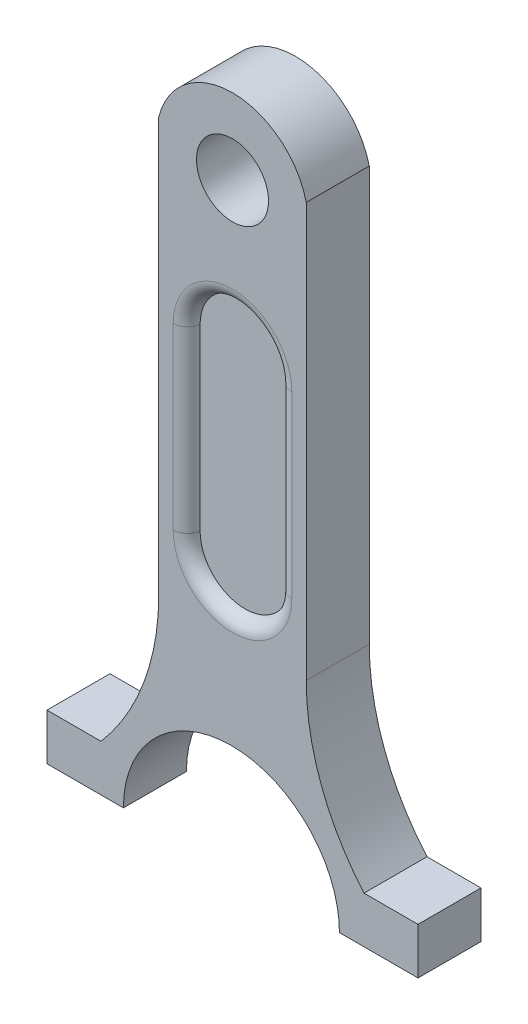
ISO-10303-21;
HEADER;
FILE_DESCRIPTION(('STEP AP214'),'2;1');
FILE_NAME('part.step','',(''),(''),'','','');
FILE_SCHEMA(('AUTOMOTIVE_DESIGN { 1 0 10303 214 1 1 1 1 }'));
ENDSEC;
DATA;
#1=APPLICATION_CONTEXT('core data for automotive mechanical design processes');
#2=APPLICATION_PROTOCOL_DEFINITION('international standard','automotive_design',2000,#1);
#3=PRODUCT_CONTEXT('',#1,'mechanical');
#4=PRODUCT('Part','Part','',(#3));
#5=PRODUCT_RELATED_PRODUCT_CATEGORY('part','',(#4));
#6=PRODUCT_DEFINITION_FORMATION('','',#4);
#7=PRODUCT_DEFINITION_CONTEXT('part definition',#1,'design');
#8=PRODUCT_DEFINITION('design','',#6,#7);
#9=PRODUCT_DEFINITION_SHAPE('','',#8);
#10=(LENGTH_UNIT() NAMED_UNIT(*) SI_UNIT(.MILLI.,.METRE.));
#11=(NAMED_UNIT(*) PLANE_ANGLE_UNIT() SI_UNIT($,.RADIAN.));
#12=(NAMED_UNIT(*) SI_UNIT($,.STERADIAN.) SOLID_ANGLE_UNIT());
#13=UNCERTAINTY_MEASURE_WITH_UNIT(LENGTH_MEASURE(1.E-05),#10,'distance_accuracy_value','');
#14=(GEOMETRIC_REPRESENTATION_CONTEXT(3) GLOBAL_UNCERTAINTY_ASSIGNED_CONTEXT((#13)) GLOBAL_UNIT_ASSIGNED_CONTEXT((#10,
#11,#12)) REPRESENTATION_CONTEXT('',''));
#15=CARTESIAN_POINT('',(0.,0.,0.));
#16=DIRECTION('',(0.,0.,1.));
#17=DIRECTION('',(1.,0.,0.));
#18=AXIS2_PLACEMENT_3D('',#15,#16,#17);
#19=CARTESIAN_POINT('',(0.,-10.7029486859636,8.89));
#20=DIRECTION('',(0.,0.,-1.));
#21=DIRECTION('',(-1.,0.,0.));
#22=AXIS2_PLACEMENT_3D('',#19,#20,#21);
#23=PLANE('',#22);
#24=DIRECTION('',(0.,-1.,0.));
#25=VECTOR('',#24,1.);
#26=CARTESIAN_POINT('',(-8.36606249903122,-10.7029486859636,8.89));
#27=LINE('',#26,#25);
#28=CARTESIAN_POINT('',(-8.36606249903122,-57.618798646351,8.89));
#29=VERTEX_POINT('',#28);
#30=CARTESIAN_POINT('',(-8.36606249903122,-32.3670987255763,8.89));
#31=VERTEX_POINT('',#30);
#32=EDGE_CURVE('E57',#29,#31,#27,.F.);
#33=ORIENTED_EDGE('',*,*,#32,.T.);
#34=CARTESIAN_POINT('',(0.,-32.3670987255763,8.89));
#35=DIRECTION('',(0.,0.,-1.));
#36=DIRECTION('',(-1.,0.,0.));
#37=AXIS2_PLACEMENT_3D('',#34,#35,#36);
#38=CIRCLE('',#37,8.36606249903122);
#39=CARTESIAN_POINT('',(8.36606249903122,-32.3670987255763,8.89));
#40=VERTEX_POINT('',#39);
#41=EDGE_CURVE('E11',#31,#40,#38,.T.);
#42=ORIENTED_EDGE('',*,*,#41,.T.);
#43=DIRECTION('',(0.,-1.,0.));
#44=VECTOR('',#43,1.);
#45=CARTESIAN_POINT('',(8.36606249903122,-10.7029486859636,8.89));
#46=LINE('',#45,#44);
#47=CARTESIAN_POINT('',(8.36606249903122,-57.618798646351,8.89));
#48=VERTEX_POINT('',#47);
#49=EDGE_CURVE('E377',#40,#48,#46,.T.);
#50=ORIENTED_EDGE('',*,*,#49,.T.);
#51=CARTESIAN_POINT('',(0.,-57.618798646351,8.89));
#52=DIRECTION('',(0.,0.,-1.));
#53=DIRECTION('',(-1.,0.,0.));
#54=AXIS2_PLACEMENT_3D('',#51,#52,#53);
#55=CIRCLE('',#54,8.36606249903122);
#56=EDGE_CURVE('E68',#48,#29,#55,.T.);
#57=ORIENTED_EDGE('',*,*,#56,.T.);
#58=EDGE_LOOP('',(#33,#42,#50,#57));
#59=FACE_BOUND('',#58,.T.);
#60=CARTESIAN_POINT('',(0.,-10.7029486859636,8.89));
#61=DIRECTION('',(0.,0.,1.));
#62=DIRECTION('',(1.,0.,0.));
#63=AXIS2_PLACEMENT_3D('',#60,#61,#62);
#64=CIRCLE('',#63,5.08);
#65=CARTESIAN_POINT('',(5.08,-10.7029486859636,8.89));
#66=VERTEX_POINT('',#65);
#67=EDGE_CURVE('E298',#66,#66,#64,.T.);
#68=ORIENTED_EDGE('',*,*,#67,.F.);
#69=EDGE_LOOP('',(#68));
#70=FACE_BOUND('',#69,.T.);
#71=DIRECTION('',(1.,0.,0.));
#72=VECTOR('',#71,1.);
#73=CARTESIAN_POINT('',(-18.55576843554,-95.0893652240123,8.89));
#74=LINE('',#73,#72);
#75=CARTESIAN_POINT('',(-26.17576843554,-95.0893652240123,8.89));
#76=VERTEX_POINT('',#75);
#77=CARTESIAN_POINT('',(-15.3923214707652,-95.0893652240123,8.89));
#78=VERTEX_POINT('',#77);
#79=EDGE_CURVE('E196',#76,#78,#74,.T.);
#80=ORIENTED_EDGE('',*,*,#79,.T.);
#81=CARTESIAN_POINT('',(-0.152321470765215,-95.0893652240123,8.89));
#82=DIRECTION('',(0.,0.,1.));
#83=DIRECTION('',(-1.,0.,0.));
#84=AXIS2_PLACEMENT_3D('',#81,#82,#83);
#85=CIRCLE('',#84,15.24);
#86=CARTESIAN_POINT('',(15.0876785292348,-95.0893652240123,8.89));
#87=VERTEX_POINT('',#86);
#88=EDGE_CURVE('E192',#87,#78,#85,.T.);
#89=ORIENTED_EDGE('',*,*,#88,.F.);
#90=CARTESIAN_POINT('',(26.17576843554,-95.0893652240123,8.89));
#91=VERTEX_POINT('',#90);
#92=EDGE_CURVE('E186',#87,#91,#74,.T.);
#93=ORIENTED_EDGE('',*,*,#92,.T.);
#94=DIRECTION('',(0.,-1.,0.));
#95=VECTOR('',#94,1.);
#96=CARTESIAN_POINT('',(26.17576843554,-88.529258158498,8.89));
#97=LINE('',#96,#95);
#98=CARTESIAN_POINT('',(26.17576843554,-88.529258158498,8.89));
#99=VERTEX_POINT('',#98);
#100=EDGE_CURVE('E191',#99,#91,#97,.T.);
#101=ORIENTED_EDGE('',*,*,#100,.F.);
#102=DIRECTION('',(-1.,0.,0.));
#103=VECTOR('',#102,1.);
#104=CARTESIAN_POINT('',(26.17576843554,-88.529258158498,8.89));
#105=LINE('',#104,#103);
#106=CARTESIAN_POINT('',(18.55576843554,-88.529258158498,8.89));
#107=VERTEX_POINT('',#106);
#108=EDGE_CURVE('E228',#99,#107,#105,.T.);
#109=ORIENTED_EDGE('',*,*,#108,.T.);
#110=CARTESIAN_POINT('',(43.9268272509493,-66.6225886735967,8.89));
#111=DIRECTION('',(0.,0.,-1.));
#112=DIRECTION('',(1.,0.,0.));
#113=AXIS2_PLACEMENT_3D('',#110,#111,#112);
#114=CIRCLE('',#113,33.5200357000953);
#115=CARTESIAN_POINT('',(10.406791550854,-66.6225886735967,8.89));
#116=VERTEX_POINT('',#115);
#117=EDGE_CURVE('E317',#107,#116,#114,.T.);
#118=ORIENTED_EDGE('',*,*,#117,.T.);
#119=DIRECTION('',(0.,1.,0.));
#120=VECTOR('',#119,1.);
#121=CARTESIAN_POINT('',(10.406791550854,-8.20258867359673,8.89));
#122=LINE('',#121,#120);
#123=CARTESIAN_POINT('',(10.406791550854,-8.20258867359673,8.89));
#124=VERTEX_POINT('',#123);
#125=EDGE_CURVE('E320',#116,#124,#122,.T.);
#126=ORIENTED_EDGE('',*,*,#125,.T.);
#127=CARTESIAN_POINT('',(0.,-10.7029486859636,8.89));
#128=DIRECTION('',(0.,0.,1.));
#129=DIRECTION('',(-1.,0.,0.));
#130=AXIS2_PLACEMENT_3D('',#127,#128,#129);
#131=CIRCLE('',#130,10.7029486859636);
#132=CARTESIAN_POINT('',(-10.406791550854,-8.20258867359673,8.89));
#133=VERTEX_POINT('',#132);
#134=EDGE_CURVE('E306',#124,#133,#131,.T.);
#135=ORIENTED_EDGE('',*,*,#134,.T.);
#136=DIRECTION('',(0.,-1.,0.));
#137=VECTOR('',#136,1.);
#138=CARTESIAN_POINT('',(-10.406791550854,-8.20258867359673,8.89));
#139=LINE('',#138,#137);
#140=CARTESIAN_POINT('',(-10.406791550854,-66.6225886735967,8.89));
#141=VERTEX_POINT('',#140);
#142=EDGE_CURVE('E310',#133,#141,#139,.T.);
#143=ORIENTED_EDGE('',*,*,#142,.T.);
#144=CARTESIAN_POINT('',(-43.9268272509493,-66.6225886735967,8.89));
#145=DIRECTION('',(0.,0.,-1.));
#146=DIRECTION('',(-1.,0.,0.));
#147=AXIS2_PLACEMENT_3D('',#144,#145,#146);
#148=CIRCLE('',#147,33.5200357000953);
#149=CARTESIAN_POINT('',(-18.55576843554,-88.529258158498,8.89));
#150=VERTEX_POINT('',#149);
#151=EDGE_CURVE('E197',#141,#150,#148,.T.);
#152=ORIENTED_EDGE('',*,*,#151,.T.);
#153=DIRECTION('',(1.,0.,0.));
#154=VECTOR('',#153,1.);
#155=CARTESIAN_POINT('',(-26.17576843554,-88.529258158498,8.89));
#156=LINE('',#155,#154);
#157=CARTESIAN_POINT('',(-26.17576843554,-88.529258158498,8.89));
#158=VERTEX_POINT('',#157);
#159=EDGE_CURVE('E253',#158,#150,#156,.T.);
#160=ORIENTED_EDGE('',*,*,#159,.F.);
#161=DIRECTION('',(0.,1.,0.));
#162=VECTOR('',#161,1.);
#163=CARTESIAN_POINT('',(-26.17576843554,-88.529258158498,8.89));
#164=LINE('',#163,#162);
#165=EDGE_CURVE('E243',#76,#158,#164,.T.);
#166=ORIENTED_EDGE('',*,*,#165,.F.);
#167=EDGE_LOOP('',(#80,#89,#93,#101,#109,#118,#126,#135,#143,#152,#160,#166));
#168=FACE_BOUND('',#167,.T.);
#169=ADVANCED_FACE('F47',(#59,#70,#168),#23,.F.);
#170=CARTESIAN_POINT('',(-18.55576843554,-95.0893652240123,8.89));
#171=DIRECTION('',(0.,1.,0.));
#172=DIRECTION('',(0.,0.,1.));
#173=AXIS2_PLACEMENT_3D('',#170,#171,#172);
#174=PLANE('',#173);
#175=CARTESIAN_POINT('',(-20.7840449531526,-95.0893652240123,4.445));
#176=DIRECTION('',(0.,-1.,0.));
#177=DIRECTION('',(0.,0.,-1.));
#178=AXIS2_PLACEMENT_3D('',#175,#176,#177);
#179=CIRCLE('',#178,3.556);
#180=CARTESIAN_POINT('',(-20.7840449531526,-95.0893652240123,0.889));
#181=VERTEX_POINT('',#180);
#182=EDGE_CURVE('E718',#181,#181,#179,.T.);
#183=ORIENTED_EDGE('',*,*,#182,.F.);
#184=EDGE_LOOP('',(#183));
#185=FACE_BOUND('',#184,.T.);
#186=DIRECTION('',(1.,0.,0.));
#187=VECTOR('',#186,1.);
#188=CARTESIAN_POINT('',(-18.55576843554,-95.0893652240123,0.));
#189=LINE('',#188,#187);
#190=CARTESIAN_POINT('',(-26.17576843554,-95.0893652240123,0.));
#191=VERTEX_POINT('',#190);
#192=CARTESIAN_POINT('',(-15.3923214707652,-95.0893652240123,0.));
#193=VERTEX_POINT('',#192);
#194=EDGE_CURVE('E333',#191,#193,#189,.T.);
#195=ORIENTED_EDGE('',*,*,#194,.T.);
#196=DIRECTION('',(0.,0.,1.));
#197=VECTOR('',#196,1.);
#198=CARTESIAN_POINT('',(-15.3923214707652,-95.0893652240123,0.));
#199=LINE('',#198,#197);
#200=EDGE_CURVE('E288',#193,#78,#199,.T.);
#201=ORIENTED_EDGE('',*,*,#200,.T.);
#202=ORIENTED_EDGE('',*,*,#79,.F.);
#203=DIRECTION('',(0.,0.,1.));
#204=VECTOR('',#203,1.);
#205=CARTESIAN_POINT('',(-26.17576843554,-95.0893652240123,0.));
#206=LINE('',#205,#204);
#207=EDGE_CURVE('E239',#191,#76,#206,.T.);
#208=ORIENTED_EDGE('',*,*,#207,.F.);
#209=EDGE_LOOP('',(#195,#201,#202,#208));
#210=FACE_BOUND('',#209,.T.);
#211=ADVANCED_FACE('F422',(#185,#210),#174,.F.);
#212=CARTESIAN_POINT('',(0.,-10.7029486859636,0.));
#213=DIRECTION('',(0.,0.,-1.));
#214=DIRECTION('',(-1.,0.,0.));
#215=AXIS2_PLACEMENT_3D('',#212,#213,#214);
#216=PLANE('',#215);
#217=DIRECTION('',(0.,1.,0.));
#218=VECTOR('',#217,1.);
#219=CARTESIAN_POINT('',(-8.36606249903122,-57.618798646351,0.));
#220=LINE('',#219,#218);
#221=CARTESIAN_POINT('',(-8.36606249903122,-32.3670987255763,0.));
#222=VERTEX_POINT('',#221);
#223=CARTESIAN_POINT('',(-8.36606249903122,-57.618798646351,0.));
#224=VERTEX_POINT('',#223);
#225=EDGE_CURVE('E370',#222,#224,#220,.F.);
#226=ORIENTED_EDGE('',*,*,#225,.T.);
#227=CARTESIAN_POINT('',(0.,-57.618798646351,0.));
#228=DIRECTION('',(0.,0.,-1.));
#229=DIRECTION('',(-1.,0.,0.));
#230=AXIS2_PLACEMENT_3D('',#227,#228,#229);
#231=CIRCLE('',#230,8.36606249903122);
#232=CARTESIAN_POINT('',(8.36606249903122,-57.618798646351,0.));
#233=VERTEX_POINT('',#232);
#234=EDGE_CURVE('E373',#224,#233,#231,.F.);
#235=ORIENTED_EDGE('',*,*,#234,.T.);
#236=DIRECTION('',(0.,-1.,0.));
#237=VECTOR('',#236,1.);
#238=CARTESIAN_POINT('',(8.36606249903122,-32.3670987255763,0.));
#239=LINE('',#238,#237);
#240=CARTESIAN_POINT('',(8.36606249903122,-32.3670987255763,0.));
#241=VERTEX_POINT('',#240);
#242=EDGE_CURVE('E367',#233,#241,#239,.F.);
#243=ORIENTED_EDGE('',*,*,#242,.T.);
#244=CARTESIAN_POINT('',(0.,-32.3670987255763,0.));
#245=DIRECTION('',(0.,0.,-1.));
#246=DIRECTION('',(-1.,0.,0.));
#247=AXIS2_PLACEMENT_3D('',#244,#245,#246);
#248=CIRCLE('',#247,8.36606249903122);
#249=EDGE_CURVE('E364',#241,#222,#248,.F.);
#250=ORIENTED_EDGE('',*,*,#249,.T.);
#251=EDGE_LOOP('',(#226,#235,#243,#250));
#252=FACE_BOUND('',#251,.T.);
#253=CARTESIAN_POINT('',(-0.152321470765215,-95.0893652240123,0.));
#254=DIRECTION('',(0.,0.,1.));
#255=DIRECTION('',(-1.,0.,0.));
#256=AXIS2_PLACEMENT_3D('',#253,#254,#255);
#257=CIRCLE('',#256,15.24);
#258=CARTESIAN_POINT('',(15.0876785292348,-95.0893652240123,0.));
#259=VERTEX_POINT('',#258);
#260=EDGE_CURVE('E284',#259,#193,#257,.T.);
#261=ORIENTED_EDGE('',*,*,#260,.T.);
#262=ORIENTED_EDGE('',*,*,#194,.F.);
#263=DIRECTION('',(0.,-1.,0.));
#264=VECTOR('',#263,1.);
#265=CARTESIAN_POINT('',(-26.17576843554,-88.529258158498,0.));
#266=LINE('',#265,#264);
#267=CARTESIAN_POINT('',(-26.17576843554,-88.529258158498,0.));
#268=VERTEX_POINT('',#267);
#269=EDGE_CURVE('E235',#268,#191,#266,.T.);
#270=ORIENTED_EDGE('',*,*,#269,.F.);
#271=DIRECTION('',(1.,0.,0.));
#272=VECTOR('',#271,1.);
#273=CARTESIAN_POINT('',(-26.17576843554,-88.529258158498,0.));
#274=LINE('',#273,#272);
#275=CARTESIAN_POINT('',(-18.55576843554,-88.529258158498,0.));
#276=VERTEX_POINT('',#275);
#277=EDGE_CURVE('E249',#268,#276,#274,.T.);
#278=ORIENTED_EDGE('',*,*,#277,.T.);
#279=CARTESIAN_POINT('',(-43.9268272509493,-66.6225886735967,0.));
#280=DIRECTION('',(0.,0.,-1.));
#281=DIRECTION('',(-1.,0.,0.));
#282=AXIS2_PLACEMENT_3D('',#279,#280,#281);
#283=CIRCLE('',#282,33.5200357000953);
#284=CARTESIAN_POINT('',(-10.406791550854,-66.6225886735967,0.));
#285=VERTEX_POINT('',#284);
#286=EDGE_CURVE('E330',#285,#276,#283,.T.);
#287=ORIENTED_EDGE('',*,*,#286,.F.);
#288=DIRECTION('',(0.,-1.,0.));
#289=VECTOR('',#288,1.);
#290=CARTESIAN_POINT('',(-10.406791550854,-8.20258867359673,0.));
#291=LINE('',#290,#289);
#292=CARTESIAN_POINT('',(-10.406791550854,-8.20258867359673,0.));
#293=VERTEX_POINT('',#292);
#294=EDGE_CURVE('E327',#293,#285,#291,.T.);
#295=ORIENTED_EDGE('',*,*,#294,.F.);
#296=CARTESIAN_POINT('',(0.,-10.7029486859636,0.));
#297=DIRECTION('',(0.,0.,1.));
#298=DIRECTION('',(-1.,0.,0.));
#299=AXIS2_PLACEMENT_3D('',#296,#297,#298);
#300=CIRCLE('',#299,10.7029486859636);
#301=CARTESIAN_POINT('',(10.406791550854,-8.20258867359673,0.));
#302=VERTEX_POINT('',#301);
#303=EDGE_CURVE('E302',#302,#293,#300,.T.);
#304=ORIENTED_EDGE('',*,*,#303,.F.);
#305=DIRECTION('',(0.,1.,0.));
#306=VECTOR('',#305,1.);
#307=CARTESIAN_POINT('',(10.406791550854,-8.20258867359673,0.));
#308=LINE('',#307,#306);
#309=CARTESIAN_POINT('',(10.406791550854,-66.6225886735967,0.));
#310=VERTEX_POINT('',#309);
#311=EDGE_CURVE('E311',#310,#302,#308,.T.);
#312=ORIENTED_EDGE('',*,*,#311,.F.);
#313=CARTESIAN_POINT('',(43.9268272509493,-66.6225886735967,0.));
#314=DIRECTION('',(0.,0.,-1.));
#315=DIRECTION('',(1.,0.,0.));
#316=AXIS2_PLACEMENT_3D('',#313,#314,#315);
#317=CIRCLE('',#316,33.5200357000953);
#318=CARTESIAN_POINT('',(18.55576843554,-88.529258158498,0.));
#319=VERTEX_POINT('',#318);
#320=EDGE_CURVE('E337',#319,#310,#317,.T.);
#321=ORIENTED_EDGE('',*,*,#320,.F.);
#322=DIRECTION('',(-1.,0.,0.));
#323=VECTOR('',#322,1.);
#324=CARTESIAN_POINT('',(26.17576843554,-88.529258158498,0.));
#325=LINE('',#324,#323);
#326=CARTESIAN_POINT('',(26.17576843554,-88.529258158498,0.));
#327=VERTEX_POINT('',#326);
#328=EDGE_CURVE('E231',#327,#319,#325,.T.);
#329=ORIENTED_EDGE('',*,*,#328,.F.);
#330=DIRECTION('',(0.,1.,0.));
#331=VECTOR('',#330,1.);
#332=CARTESIAN_POINT('',(26.17576843554,-88.529258158498,0.));
#333=LINE('',#332,#331);
#334=CARTESIAN_POINT('',(26.17576843554,-95.0893652240123,0.));
#335=VERTEX_POINT('',#334);
#336=EDGE_CURVE('E207',#335,#327,#333,.T.);
#337=ORIENTED_EDGE('',*,*,#336,.F.);
#338=EDGE_CURVE('E203',#259,#335,#189,.T.);
#339=ORIENTED_EDGE('',*,*,#338,.F.);
#340=EDGE_LOOP('',(#261,#262,#270,#278,#287,#295,#304,#312,#321,#329,#337,#339));
#341=FACE_BOUND('',#340,.T.);
#342=CARTESIAN_POINT('',(0.,-10.7029486859636,0.));
#343=DIRECTION('',(0.,0.,1.));
#344=DIRECTION('',(1.,0.,0.));
#345=AXIS2_PLACEMENT_3D('',#342,#343,#344);
#346=CIRCLE('',#345,5.08);
#347=CARTESIAN_POINT('',(5.08,-10.7029486859636,0.));
#348=VERTEX_POINT('',#347);
#349=EDGE_CURVE('E294',#348,#348,#346,.T.);
#350=ORIENTED_EDGE('',*,*,#349,.T.);
#351=EDGE_LOOP('',(#350));
#352=FACE_BOUND('',#351,.T.);
#353=ADVANCED_FACE('F434',(#252,#341,#352),#216,.T.);
#354=CARTESIAN_POINT('',(0.,-10.7029486859636,8.89));
#355=DIRECTION('',(0.,0.,-1.));
#356=DIRECTION('',(-1.,0.,0.));
#357=AXIS2_PLACEMENT_3D('',#354,#355,#356);
#358=CYLINDRICAL_SURFACE('',#357,10.7029486859636);
#359=ORIENTED_EDGE('',*,*,#303,.T.);
#360=DIRECTION('',(0.,0.,-1.));
#361=VECTOR('',#360,1.);
#362=CARTESIAN_POINT('',(-10.406791550854,-8.20258867359673,8.89));
#363=LINE('',#362,#361);
#364=EDGE_CURVE('E360',#133,#293,#363,.T.);
#365=ORIENTED_EDGE('',*,*,#364,.F.);
#366=ORIENTED_EDGE('',*,*,#134,.F.);
#367=DIRECTION('',(0.,0.,-1.));
#368=VECTOR('',#367,1.);
#369=CARTESIAN_POINT('',(10.406791550854,-8.20258867359673,8.89));
#370=LINE('',#369,#368);
#371=EDGE_CURVE('E323',#124,#302,#370,.T.);
#372=ORIENTED_EDGE('',*,*,#371,.T.);
#373=EDGE_LOOP('',(#359,#365,#366,#372));
#374=FACE_BOUND('',#373,.T.);
#375=ADVANCED_FACE('F436',(#374),#358,.T.);
#376=CARTESIAN_POINT('',(-10.406791550854,-8.20258867359673,8.89));
#377=DIRECTION('',(1.,0.,0.));
#378=DIRECTION('',(0.,1.,0.));
#379=AXIS2_PLACEMENT_3D('',#376,#377,#378);
#380=PLANE('',#379);
#381=ORIENTED_EDGE('',*,*,#294,.T.);
#382=DIRECTION('',(0.,0.,-1.));
#383=VECTOR('',#382,1.);
#384=CARTESIAN_POINT('',(-10.406791550854,-66.6225886735967,8.89));
#385=LINE('',#384,#383);
#386=EDGE_CURVE('E356',#141,#285,#385,.T.);
#387=ORIENTED_EDGE('',*,*,#386,.F.);
#388=ORIENTED_EDGE('',*,*,#142,.F.);
#389=ORIENTED_EDGE('',*,*,#364,.T.);
#390=EDGE_LOOP('',(#381,#387,#388,#389));
#391=FACE_BOUND('',#390,.T.);
#392=ADVANCED_FACE('F443',(#391),#380,.F.);
#393=CARTESIAN_POINT('',(-43.9268272509493,-66.6225886735967,8.89));
#394=DIRECTION('',(0.,0.,-1.));
#395=DIRECTION('',(-1.,0.,0.));
#396=AXIS2_PLACEMENT_3D('',#393,#394,#395);
#397=CYLINDRICAL_SURFACE('',#396,33.5200357000953);
#398=ORIENTED_EDGE('',*,*,#286,.T.);
#399=DIRECTION('',(0.,0.,-1.));
#400=VECTOR('',#399,1.);
#401=CARTESIAN_POINT('',(-18.55576843554,-88.529258158498,8.89));
#402=LINE('',#401,#400);
#403=EDGE_CURVE('E352',#150,#276,#402,.T.);
#404=ORIENTED_EDGE('',*,*,#403,.F.);
#405=ORIENTED_EDGE('',*,*,#151,.F.);
#406=ORIENTED_EDGE('',*,*,#386,.T.);
#407=EDGE_LOOP('',(#398,#404,#405,#406));
#408=FACE_BOUND('',#407,.T.);
#409=ADVANCED_FACE('F459',(#408),#397,.F.);
#410=CARTESIAN_POINT('',(20.4794020116222,-95.0893652240123,4.445));
#411=DIRECTION('',(0.,-1.,0.));
#412=DIRECTION('',(0.,0.,1.));
#413=AXIS2_PLACEMENT_3D('',#410,#411,#412);
#414=CIRCLE('',#413,3.556);
#415=CARTESIAN_POINT('',(20.4794020116222,-95.0893652240123,0.889000000000005));
#416=VERTEX_POINT('',#415);
#417=EDGE_CURVE('E722',#416,#416,#414,.T.);
#418=ORIENTED_EDGE('',*,*,#417,.F.);
#419=EDGE_LOOP('',(#418));
#420=FACE_BOUND('',#419,.T.);
#421=ORIENTED_EDGE('',*,*,#92,.F.);
#422=DIRECTION('',(0.,0.,1.));
#423=VECTOR('',#422,1.);
#424=CARTESIAN_POINT('',(15.0876785292348,-95.0893652240123,0.));
#425=LINE('',#424,#423);
#426=EDGE_CURVE('E291',#259,#87,#425,.T.);
#427=ORIENTED_EDGE('',*,*,#426,.F.);
#428=ORIENTED_EDGE('',*,*,#338,.T.);
#429=DIRECTION('',(0.,0.,-1.));
#430=VECTOR('',#429,1.);
#431=CARTESIAN_POINT('',(26.17576843554,-95.0893652240123,8.89));
#432=LINE('',#431,#430);
#433=EDGE_CURVE('E200',#91,#335,#432,.T.);
#434=ORIENTED_EDGE('',*,*,#433,.F.);
#435=EDGE_LOOP('',(#421,#427,#428,#434));
#436=FACE_BOUND('',#435,.T.);
#437=ADVANCED_FACE('F201',(#420,#436),#174,.F.);
#438=CARTESIAN_POINT('',(43.9268272509493,-66.6225886735967,8.89));
#439=DIRECTION('',(0.,0.,-1.));
#440=DIRECTION('',(-1.,0.,0.));
#441=AXIS2_PLACEMENT_3D('',#438,#439,#440);
#442=CYLINDRICAL_SURFACE('',#441,33.5200357000953);
#443=ORIENTED_EDGE('',*,*,#320,.T.);
#444=DIRECTION('',(0.,0.,-1.));
#445=VECTOR('',#444,1.);
#446=CARTESIAN_POINT('',(10.406791550854,-66.6225886735967,8.89));
#447=LINE('',#446,#445);
#448=EDGE_CURVE('E345',#116,#310,#447,.T.);
#449=ORIENTED_EDGE('',*,*,#448,.F.);
#450=ORIENTED_EDGE('',*,*,#117,.F.);
#451=DIRECTION('',(0.,0.,-1.));
#452=VECTOR('',#451,1.);
#453=CARTESIAN_POINT('',(18.55576843554,-88.529258158498,8.89));
#454=LINE('',#453,#452);
#455=EDGE_CURVE('E349',#107,#319,#454,.T.);
#456=ORIENTED_EDGE('',*,*,#455,.T.);
#457=EDGE_LOOP('',(#443,#449,#450,#456));
#458=FACE_BOUND('',#457,.T.);
#459=ADVANCED_FACE('F453',(#458),#442,.F.);
#460=CARTESIAN_POINT('',(10.406791550854,-8.20258867359673,8.89));
#461=DIRECTION('',(-1.,0.,0.));
#462=DIRECTION('',(0.,0.,1.));
#463=AXIS2_PLACEMENT_3D('',#460,#461,#462);
#464=PLANE('',#463);
#465=ORIENTED_EDGE('',*,*,#311,.T.);
#466=ORIENTED_EDGE('',*,*,#371,.F.);
#467=ORIENTED_EDGE('',*,*,#125,.F.);
#468=ORIENTED_EDGE('',*,*,#448,.T.);
#469=EDGE_LOOP('',(#465,#466,#467,#468));
#470=FACE_BOUND('',#469,.T.);
#471=ADVANCED_FACE('F430',(#470),#464,.F.);
#472=CARTESIAN_POINT('',(0.,-10.7029486859636,8.89));
#473=DIRECTION('',(0.,0.,-1.));
#474=DIRECTION('',(-1.,0.,0.));
#475=AXIS2_PLACEMENT_3D('',#472,#473,#474);
#476=CYLINDRICAL_SURFACE('',#475,5.08);
#477=ORIENTED_EDGE('',*,*,#67,.T.);
#478=EDGE_LOOP('',(#477));
#479=FACE_BOUND('',#478,.T.);
#480=ORIENTED_EDGE('',*,*,#349,.F.);
#481=EDGE_LOOP('',(#480));
#482=FACE_BOUND('',#481,.T.);
#483=ADVANCED_FACE('F426',(#479,#482),#476,.F.);
#484=CARTESIAN_POINT('',(-0.152321470765215,-95.0893652240123,0.));
#485=DIRECTION('',(0.,0.,1.));
#486=DIRECTION('',(1.,0.,0.));
#487=AXIS2_PLACEMENT_3D('',#484,#485,#486);
#488=CYLINDRICAL_SURFACE('',#487,15.24);
#489=ORIENTED_EDGE('',*,*,#88,.T.);
#490=ORIENTED_EDGE('',*,*,#200,.F.);
#491=ORIENTED_EDGE('',*,*,#260,.F.);
#492=ORIENTED_EDGE('',*,*,#426,.T.);
#493=EDGE_LOOP('',(#489,#490,#491,#492));
#494=FACE_BOUND('',#493,.T.);
#495=ADVANCED_FACE('F429',(#494),#488,.F.);
#496=CARTESIAN_POINT('',(0.,-32.3670987255763,7.112));
#497=DIRECTION('',(0.,0.,-1.));
#498=DIRECTION('',(-1.,0.,0.));
#499=AXIS2_PLACEMENT_3D('',#496,#497,#498);
#500=PLANE('',#499);
#501=CARTESIAN_POINT('',(0.,-32.3670987255763,7.112));
#502=DIRECTION('',(0.,0.,-1.));
#503=DIRECTION('',(-1.,0.,0.));
#504=AXIS2_PLACEMENT_3D('',#501,#502,#503);
#505=CIRCLE('',#504,6.35);
#506=CARTESIAN_POINT('',(-6.35,-32.3670987255763,7.112));
#507=VERTEX_POINT('',#506);
#508=CARTESIAN_POINT('',(6.35,-32.3670987255763,7.112));
#509=VERTEX_POINT('',#508);
#510=EDGE_CURVE('E270',#507,#509,#505,.T.);
#511=ORIENTED_EDGE('',*,*,#510,.F.);
#512=DIRECTION('',(0.,-1.,0.));
#513=VECTOR('',#512,1.);
#514=CARTESIAN_POINT('',(-6.35,-32.3670987255763,7.112));
#515=LINE('',#514,#513);
#516=CARTESIAN_POINT('',(-6.35,-57.618798646351,7.112));
#517=VERTEX_POINT('',#516);
#518=EDGE_CURVE('E281',#507,#517,#515,.T.);
#519=ORIENTED_EDGE('',*,*,#518,.T.);
#520=CARTESIAN_POINT('',(0.,-57.618798646351,7.112));
#521=DIRECTION('',(0.,0.,1.));
#522=DIRECTION('',(1.,0.,0.));
#523=AXIS2_PLACEMENT_3D('',#520,#521,#522);
#524=CIRCLE('',#523,6.35);
#525=CARTESIAN_POINT('',(6.35,-57.618798646351,7.112));
#526=VERTEX_POINT('',#525);
#527=EDGE_CURVE('E278',#517,#526,#524,.T.);
#528=ORIENTED_EDGE('',*,*,#527,.T.);
#529=DIRECTION('',(0.,-1.,0.));
#530=VECTOR('',#529,1.);
#531=CARTESIAN_POINT('',(6.35,-32.3670987255763,7.112));
#532=LINE('',#531,#530);
#533=EDGE_CURVE('E274',#509,#526,#532,.T.);
#534=ORIENTED_EDGE('',*,*,#533,.F.);
#535=EDGE_LOOP('',(#511,#519,#528,#534));
#536=FACE_BOUND('',#535,.T.);
#537=ADVANCED_FACE('F414',(#536),#500,.F.);
#538=CARTESIAN_POINT('',(0.,-32.3670987255763,1.778));
#539=DIRECTION('',(0.,0.,-1.));
#540=DIRECTION('',(-1.,0.,0.));
#541=AXIS2_PLACEMENT_3D('',#538,#539,#540);
#542=PLANE('',#541);
#543=DIRECTION('',(0.,1.,0.));
#544=VECTOR('',#543,1.);
#545=CARTESIAN_POINT('',(-6.35,-57.618798646351,1.778));
#546=LINE('',#545,#544);
#547=CARTESIAN_POINT('',(-6.35,-57.618798646351,1.778));
#548=VERTEX_POINT('',#547);
#549=CARTESIAN_POINT('',(-6.35,-32.3670987255763,1.778));
#550=VERTEX_POINT('',#549);
#551=EDGE_CURVE('E257',#548,#550,#546,.T.);
#552=ORIENTED_EDGE('',*,*,#551,.T.);
#553=CARTESIAN_POINT('',(0.,-32.3670987255763,1.778));
#554=DIRECTION('',(0.,0.,-1.));
#555=DIRECTION('',(-1.,0.,0.));
#556=AXIS2_PLACEMENT_3D('',#553,#554,#555);
#557=CIRCLE('',#556,6.35);
#558=CARTESIAN_POINT('',(6.35,-32.3670987255763,1.778));
#559=VERTEX_POINT('',#558);
#560=EDGE_CURVE('E260',#550,#559,#557,.T.);
#561=ORIENTED_EDGE('',*,*,#560,.T.);
#562=DIRECTION('',(0.,-1.,0.));
#563=VECTOR('',#562,1.);
#564=CARTESIAN_POINT('',(6.35,-32.3670987255763,1.778));
#565=LINE('',#564,#563);
#566=CARTESIAN_POINT('',(6.35,-57.618798646351,1.778));
#567=VERTEX_POINT('',#566);
#568=EDGE_CURVE('E263',#559,#567,#565,.T.);
#569=ORIENTED_EDGE('',*,*,#568,.T.);
#570=CARTESIAN_POINT('',(0.,-57.618798646351,1.778));
#571=DIRECTION('',(0.,0.,-1.));
#572=DIRECTION('',(-1.,0.,0.));
#573=AXIS2_PLACEMENT_3D('',#570,#571,#572);
#574=CIRCLE('',#573,6.35);
#575=EDGE_CURVE('E266',#567,#548,#574,.T.);
#576=ORIENTED_EDGE('',*,*,#575,.T.);
#577=EDGE_LOOP('',(#552,#561,#569,#576));
#578=FACE_BOUND('',#577,.T.);
#579=ADVANCED_FACE('F518',(#578),#542,.T.);
#580=CARTESIAN_POINT('',(-26.17576843554,-88.529258158498,0.));
#581=DIRECTION('',(0.,-1.,0.));
#582=DIRECTION('',(0.,0.,-1.));
#583=AXIS2_PLACEMENT_3D('',#580,#581,#582);
#584=PLANE('',#583);
#585=ORIENTED_EDGE('',*,*,#403,.T.);
#586=ORIENTED_EDGE('',*,*,#277,.F.);
#587=DIRECTION('',(0.,0.,-1.));
#588=VECTOR('',#587,1.);
#589=CARTESIAN_POINT('',(-26.17576843554,-88.529258158498,0.));
#590=LINE('',#589,#588);
#591=EDGE_CURVE('E246',#158,#268,#590,.T.);
#592=ORIENTED_EDGE('',*,*,#591,.F.);
#593=ORIENTED_EDGE('',*,*,#159,.T.);
#594=EDGE_LOOP('',(#585,#586,#592,#593));
#595=FACE_BOUND('',#594,.T.);
#596=ADVANCED_FACE('F521',(#595),#584,.F.);
#597=CARTESIAN_POINT('',(-26.17576843554,0.,0.));
#598=DIRECTION('',(-1.,0.,0.));
#599=DIRECTION('',(0.,0.,1.));
#600=AXIS2_PLACEMENT_3D('',#597,#598,#599);
#601=PLANE('',#600);
#602=ORIENTED_EDGE('',*,*,#269,.T.);
#603=ORIENTED_EDGE('',*,*,#207,.T.);
#604=ORIENTED_EDGE('',*,*,#165,.T.);
#605=ORIENTED_EDGE('',*,*,#591,.T.);
#606=EDGE_LOOP('',(#602,#603,#604,#605));
#607=FACE_BOUND('',#606,.T.);
#608=ADVANCED_FACE('F621',(#607),#601,.T.);
#609=CARTESIAN_POINT('',(26.17576843554,-88.529258158498,8.89));
#610=DIRECTION('',(0.,-1.,0.));
#611=DIRECTION('',(0.,0.,-1.));
#612=AXIS2_PLACEMENT_3D('',#609,#610,#611);
#613=PLANE('',#612);
#614=ORIENTED_EDGE('',*,*,#455,.F.);
#615=ORIENTED_EDGE('',*,*,#108,.F.);
#616=DIRECTION('',(0.,0.,1.));
#617=VECTOR('',#616,1.);
#618=CARTESIAN_POINT('',(26.17576843554,-88.529258158498,8.89));
#619=LINE('',#618,#617);
#620=EDGE_CURVE('E211',#327,#99,#619,.T.);
#621=ORIENTED_EDGE('',*,*,#620,.F.);
#622=ORIENTED_EDGE('',*,*,#328,.T.);
#623=EDGE_LOOP('',(#614,#615,#621,#622));
#624=FACE_BOUND('',#623,.T.);
#625=ADVANCED_FACE('F629',(#624),#613,.F.);
#626=CARTESIAN_POINT('',(26.17576843554,0.,0.));
#627=DIRECTION('',(1.,0.,0.));
#628=DIRECTION('',(0.,0.,-1.));
#629=AXIS2_PLACEMENT_3D('',#626,#627,#628);
#630=PLANE('',#629);
#631=ORIENTED_EDGE('',*,*,#100,.T.);
#632=ORIENTED_EDGE('',*,*,#433,.T.);
#633=ORIENTED_EDGE('',*,*,#336,.T.);
#634=ORIENTED_EDGE('',*,*,#620,.T.);
#635=EDGE_LOOP('',(#631,#632,#633,#634));
#636=FACE_BOUND('',#635,.T.);
#637=ADVANCED_FACE('F209',(#636),#630,.T.);
#638=CARTESIAN_POINT('',(0.,-32.3670987255763,2.032));
#639=DIRECTION('',(0.,0.,-1.));
#640=DIRECTION('',(-1.,0.,0.));
#641=AXIS2_PLACEMENT_3D('',#638,#639,#640);
#642=TOROIDAL_SURFACE('',#641,8.36606249903122,2.032);
#643=CARTESIAN_POINT('',(-8.36606249903122,-32.3670987255763,2.032));
#644=DIRECTION('',(0.,-1.,0.));
#645=DIRECTION('',(0.,0.,-1.));
#646=AXIS2_PLACEMENT_3D('',#643,#644,#645);
#647=CIRCLE('',#646,2.032);
#648=EDGE_CURVE('E218',#222,#550,#647,.T.);
#649=ORIENTED_EDGE('',*,*,#648,.F.);
#650=ORIENTED_EDGE('',*,*,#249,.F.);
#651=CARTESIAN_POINT('',(8.36606249903122,-32.3670987255763,2.032));
#652=DIRECTION('',(0.,-1.,0.));
#653=DIRECTION('',(0.,0.,-1.));
#654=AXIS2_PLACEMENT_3D('',#651,#652,#653);
#655=CIRCLE('',#654,2.032);
#656=EDGE_CURVE('E214',#559,#241,#655,.T.);
#657=ORIENTED_EDGE('',*,*,#656,.F.);
#658=ORIENTED_EDGE('',*,*,#560,.F.);
#659=EDGE_LOOP('',(#649,#650,#657,#658));
#660=FACE_BOUND('',#659,.T.);
#661=ADVANCED_FACE('F478',(#660),#642,.T.);
#662=CARTESIAN_POINT('',(8.36606249903122,-32.3670987255763,2.032));
#663=DIRECTION('',(0.,1.,0.));
#664=DIRECTION('',(0.,0.,1.));
#665=AXIS2_PLACEMENT_3D('',#662,#663,#664);
#666=CYLINDRICAL_SURFACE('',#665,2.032);
#667=ORIENTED_EDGE('',*,*,#656,.T.);
#668=ORIENTED_EDGE('',*,*,#242,.F.);
#669=CARTESIAN_POINT('',(8.36606249903122,-57.618798646351,2.032));
#670=DIRECTION('',(0.,-1.,0.));
#671=DIRECTION('',(0.,0.,-1.));
#672=AXIS2_PLACEMENT_3D('',#669,#670,#671);
#673=CIRCLE('',#672,2.032);
#674=EDGE_CURVE('E387',#567,#233,#673,.T.);
#675=ORIENTED_EDGE('',*,*,#674,.F.);
#676=ORIENTED_EDGE('',*,*,#568,.F.);
#677=EDGE_LOOP('',(#667,#668,#675,#676));
#678=FACE_BOUND('',#677,.T.);
#679=ADVANCED_FACE('F474',(#678),#666,.T.);
#680=CARTESIAN_POINT('',(-8.36606249903122,-57.618798646351,2.032));
#681=DIRECTION('',(0.,-1.,0.));
#682=DIRECTION('',(0.,0.,-1.));
#683=AXIS2_PLACEMENT_3D('',#680,#681,#682);
#684=CYLINDRICAL_SURFACE('',#683,2.032);
#685=ORIENTED_EDGE('',*,*,#648,.T.);
#686=ORIENTED_EDGE('',*,*,#551,.F.);
#687=CARTESIAN_POINT('',(-8.36606249903122,-57.618798646351,2.032));
#688=DIRECTION('',(0.,-1.,0.));
#689=DIRECTION('',(0.,0.,-1.));
#690=AXIS2_PLACEMENT_3D('',#687,#688,#689);
#691=CIRCLE('',#690,2.032);
#692=EDGE_CURVE('E384',#224,#548,#691,.T.);
#693=ORIENTED_EDGE('',*,*,#692,.F.);
#694=ORIENTED_EDGE('',*,*,#225,.F.);
#695=EDGE_LOOP('',(#685,#686,#693,#694));
#696=FACE_BOUND('',#695,.T.);
#697=ADVANCED_FACE('F470',(#696),#684,.T.);
#698=CARTESIAN_POINT('',(0.,-57.618798646351,2.032));
#699=DIRECTION('',(0.,0.,-1.));
#700=DIRECTION('',(-1.,0.,0.));
#701=AXIS2_PLACEMENT_3D('',#698,#699,#700);
#702=TOROIDAL_SURFACE('',#701,8.36606249903122,2.032);
#703=ORIENTED_EDGE('',*,*,#674,.T.);
#704=ORIENTED_EDGE('',*,*,#234,.F.);
#705=ORIENTED_EDGE('',*,*,#692,.T.);
#706=ORIENTED_EDGE('',*,*,#575,.F.);
#707=EDGE_LOOP('',(#703,#704,#705,#706));
#708=FACE_BOUND('',#707,.T.);
#709=ADVANCED_FACE('F467',(#708),#702,.T.);
#710=CARTESIAN_POINT('',(0.,-57.618798646351,6.858));
#711=DIRECTION('',(0.,0.,-1.));
#712=DIRECTION('',(-1.,0.,0.));
#713=AXIS2_PLACEMENT_3D('',#710,#711,#712);
#714=TOROIDAL_SURFACE('',#713,8.36606249903122,2.032);
#715=CARTESIAN_POINT('',(8.36606249903122,-57.618798646351,6.858));
#716=DIRECTION('',(0.,1.,0.));
#717=DIRECTION('',(0.,0.,1.));
#718=AXIS2_PLACEMENT_3D('',#715,#716,#717);
#719=CIRCLE('',#718,2.032);
#720=EDGE_CURVE('E399',#526,#48,#719,.T.);
#721=ORIENTED_EDGE('',*,*,#720,.F.);
#722=ORIENTED_EDGE('',*,*,#527,.F.);
#723=CARTESIAN_POINT('',(-8.36606249903122,-57.618798646351,6.858));
#724=DIRECTION('',(0.,1.,0.));
#725=DIRECTION('',(0.,0.,1.));
#726=AXIS2_PLACEMENT_3D('',#723,#724,#725);
#727=CIRCLE('',#726,2.032);
#728=EDGE_CURVE('E51',#29,#517,#727,.T.);
#729=ORIENTED_EDGE('',*,*,#728,.F.);
#730=ORIENTED_EDGE('',*,*,#56,.F.);
#731=EDGE_LOOP('',(#721,#722,#729,#730));
#732=FACE_BOUND('',#731,.T.);
#733=ADVANCED_FACE('F49',(#732),#714,.T.);
#734=CARTESIAN_POINT('',(-8.36606249903122,-32.3670987255763,6.858));
#735=DIRECTION('',(0.,-1.,0.));
#736=DIRECTION('',(0.,0.,-1.));
#737=AXIS2_PLACEMENT_3D('',#734,#735,#736);
#738=CYLINDRICAL_SURFACE('',#737,2.032);
#739=ORIENTED_EDGE('',*,*,#728,.T.);
#740=ORIENTED_EDGE('',*,*,#518,.F.);
#741=CARTESIAN_POINT('',(-8.36606249903122,-32.3670987255763,6.858));
#742=DIRECTION('',(0.,1.,0.));
#743=DIRECTION('',(0.,0.,1.));
#744=AXIS2_PLACEMENT_3D('',#741,#742,#743);
#745=CIRCLE('',#744,2.032);
#746=EDGE_CURVE('E396',#31,#507,#745,.T.);
#747=ORIENTED_EDGE('',*,*,#746,.F.);
#748=ORIENTED_EDGE('',*,*,#32,.F.);
#749=EDGE_LOOP('',(#739,#740,#747,#748));
#750=FACE_BOUND('',#749,.T.);
#751=ADVANCED_FACE('F409',(#750),#738,.T.);
#752=CARTESIAN_POINT('',(8.36606249903122,-32.3670987255763,6.858));
#753=DIRECTION('',(0.,-1.,0.));
#754=DIRECTION('',(0.,0.,-1.));
#755=AXIS2_PLACEMENT_3D('',#752,#753,#754);
#756=CYLINDRICAL_SURFACE('',#755,2.032);
#757=ORIENTED_EDGE('',*,*,#720,.T.);
#758=ORIENTED_EDGE('',*,*,#49,.F.);
#759=CARTESIAN_POINT('',(8.36606249903122,-32.3670987255763,6.858));
#760=DIRECTION('',(0.,1.,0.));
#761=DIRECTION('',(0.,0.,1.));
#762=AXIS2_PLACEMENT_3D('',#759,#760,#761);
#763=CIRCLE('',#762,2.032);
#764=EDGE_CURVE('E393',#509,#40,#763,.T.);
#765=ORIENTED_EDGE('',*,*,#764,.F.);
#766=ORIENTED_EDGE('',*,*,#533,.T.);
#767=EDGE_LOOP('',(#757,#758,#765,#766));
#768=FACE_BOUND('',#767,.T.);
#769=ADVANCED_FACE('F419',(#768),#756,.T.);
#770=CARTESIAN_POINT('',(0.,-32.3670987255763,6.858));
#771=DIRECTION('',(0.,0.,-1.));
#772=DIRECTION('',(-1.,0.,0.));
#773=AXIS2_PLACEMENT_3D('',#770,#771,#772);
#774=TOROIDAL_SURFACE('',#773,8.36606249903122,2.032);
#775=ORIENTED_EDGE('',*,*,#746,.T.);
#776=ORIENTED_EDGE('',*,*,#510,.T.);
#777=ORIENTED_EDGE('',*,*,#764,.T.);
#778=ORIENTED_EDGE('',*,*,#41,.F.);
#779=EDGE_LOOP('',(#775,#776,#777,#778));
#780=FACE_BOUND('',#779,.T.);
#781=ADVANCED_FACE('F417',(#780),#774,.T.);
#782=CARTESIAN_POINT('',(20.4794020116222,-91.2793652240123,4.445));
#783=DIRECTION('',(0.,-1.,0.));
#784=DIRECTION('',(0.,0.,-1.));
#785=AXIS2_PLACEMENT_3D('',#782,#783,#784);
#786=CYLINDRICAL_SURFACE('',#785,3.556);
#787=CARTESIAN_POINT('',(20.4794020116222,-91.2793652240123,4.445));
#788=DIRECTION('',(0.,-1.,0.));
#789=DIRECTION('',(0.,0.,1.));
#790=AXIS2_PLACEMENT_3D('',#787,#788,#789);
#791=CIRCLE('',#790,3.556);
#792=CARTESIAN_POINT('',(20.4794020116222,-91.2793652240123,0.889000000000005));
#793=VERTEX_POINT('',#792);
#794=EDGE_CURVE('E221',#793,#793,#791,.T.);
#795=CARTESIAN_POINT('',(20.4794020116222,-91.2793652240123,0.889000000000005));
#796=CARTESIAN_POINT('',(20.4794020116222,-91.3190527240123,0.889000000000005));
#797=CARTESIAN_POINT('',(20.4794020116222,-91.3587402240123,0.889000000000005));
#798=CARTESIAN_POINT('',(20.4794020116222,-91.4381152240123,0.889000000000005));
#799=CARTESIAN_POINT('',(20.4794020116222,-91.4778027240123,0.889000000000005));
#800=CARTESIAN_POINT('',(20.4794020116222,-91.5571777240123,0.889000000000005));
#801=CARTESIAN_POINT('',(20.4794020116222,-91.5968652240123,0.889000000000005));
#802=CARTESIAN_POINT('',(20.4794020116222,-91.6762402240123,0.889000000000005));
#803=CARTESIAN_POINT('',(20.4794020116222,-91.7159277240123,0.889000000000005));
#804=CARTESIAN_POINT('',(20.4794020116222,-91.7953027240123,0.889000000000005));
#805=CARTESIAN_POINT('',(20.4794020116222,-91.8349902240123,0.889000000000005));
#806=CARTESIAN_POINT('',(20.4794020116222,-91.9143652240123,0.889000000000005));
#807=CARTESIAN_POINT('',(20.4794020116222,-91.9540527240123,0.889000000000005));
#808=CARTESIAN_POINT('',(20.4794020116222,-92.0334277240123,0.889000000000005));
#809=CARTESIAN_POINT('',(20.4794020116222,-92.0731152240123,0.889000000000005));
#810=CARTESIAN_POINT('',(20.4794020116222,-92.1524902240123,0.889000000000005));
#811=CARTESIAN_POINT('',(20.4794020116222,-92.1921777240123,0.889000000000005));
#812=CARTESIAN_POINT('',(20.4794020116222,-92.2715527240123,0.889000000000005));
#813=CARTESIAN_POINT('',(20.4794020116222,-92.3112402240123,0.889000000000005));
#814=CARTESIAN_POINT('',(20.4794020116222,-92.3906152240123,0.889000000000005));
#815=CARTESIAN_POINT('',(20.4794020116222,-92.4303027240123,0.889000000000005));
#816=CARTESIAN_POINT('',(20.4794020116222,-92.5096777240123,0.889000000000005));
#817=CARTESIAN_POINT('',(20.4794020116222,-92.5493652240123,0.889000000000005));
#818=CARTESIAN_POINT('',(20.4794020116222,-92.6287402240123,0.889000000000005));
#819=CARTESIAN_POINT('',(20.4794020116222,-92.6684277240123,0.889000000000005));
#820=CARTESIAN_POINT('',(20.4794020116222,-92.7478027240123,0.889000000000005));
#821=CARTESIAN_POINT('',(20.4794020116222,-92.7874902240123,0.889000000000005));
#822=CARTESIAN_POINT('',(20.4794020116222,-92.8668652240123,0.889000000000005));
#823=CARTESIAN_POINT('',(20.4794020116222,-92.9065527240123,0.889000000000005));
#824=CARTESIAN_POINT('',(20.4794020116222,-92.9859277240123,0.889000000000005));
#825=CARTESIAN_POINT('',(20.4794020116222,-93.0256152240123,0.889000000000005));
#826=CARTESIAN_POINT('',(20.4794020116222,-93.1049902240123,0.889000000000005));
#827=CARTESIAN_POINT('',(20.4794020116222,-93.1446777240123,0.889000000000005));
#828=CARTESIAN_POINT('',(20.4794020116222,-93.2240527240123,0.889000000000005));
#829=CARTESIAN_POINT('',(20.4794020116222,-93.2637402240123,0.889000000000005));
#830=CARTESIAN_POINT('',(20.4794020116222,-93.3431152240123,0.889000000000005));
#831=CARTESIAN_POINT('',(20.4794020116222,-93.3828027240123,0.889000000000005));
#832=CARTESIAN_POINT('',(20.4794020116222,-93.4621777240123,0.889000000000005));
#833=CARTESIAN_POINT('',(20.4794020116222,-93.5018652240123,0.889000000000005));
#834=CARTESIAN_POINT('',(20.4794020116222,-93.5812402240123,0.889000000000005));
#835=CARTESIAN_POINT('',(20.4794020116222,-93.6209277240123,0.889000000000005));
#836=CARTESIAN_POINT('',(20.4794020116222,-93.7003027240123,0.889000000000005));
#837=CARTESIAN_POINT('',(20.4794020116222,-93.7399902240123,0.889000000000005));
#838=CARTESIAN_POINT('',(20.4794020116222,-93.8193652240123,0.889000000000005));
#839=CARTESIAN_POINT('',(20.4794020116222,-93.8590527240123,0.889000000000005));
#840=CARTESIAN_POINT('',(20.4794020116222,-93.9384277240123,0.889000000000005));
#841=CARTESIAN_POINT('',(20.4794020116222,-93.9781152240123,0.889000000000005));
#842=CARTESIAN_POINT('',(20.4794020116222,-94.0574902240123,0.889000000000005));
#843=CARTESIAN_POINT('',(20.4794020116222,-94.0971777240123,0.889000000000005));
#844=CARTESIAN_POINT('',(20.4794020116222,-94.1765527240123,0.889000000000005));
#845=CARTESIAN_POINT('',(20.4794020116222,-94.2162402240123,0.889000000000005));
#846=CARTESIAN_POINT('',(20.4794020116222,-94.2956152240123,0.889000000000005));
#847=CARTESIAN_POINT('',(20.4794020116222,-94.3353027240123,0.889000000000005));
#848=CARTESIAN_POINT('',(20.4794020116222,-94.4146777240123,0.889000000000005));
#849=CARTESIAN_POINT('',(20.4794020116222,-94.4543652240123,0.889000000000005));
#850=CARTESIAN_POINT('',(20.4794020116222,-94.5337402240123,0.889000000000005));
#851=CARTESIAN_POINT('',(20.4794020116222,-94.5734277240123,0.889000000000005));
#852=CARTESIAN_POINT('',(20.4794020116222,-94.6528027240123,0.889000000000005));
#853=CARTESIAN_POINT('',(20.4794020116222,-94.6924902240123,0.889000000000005));
#854=CARTESIAN_POINT('',(20.4794020116222,-94.7718652240123,0.889000000000005));
#855=CARTESIAN_POINT('',(20.4794020116222,-94.8115527240123,0.889000000000005));
#856=CARTESIAN_POINT('',(20.4794020116222,-94.8909277240123,0.889000000000005));
#857=CARTESIAN_POINT('',(20.4794020116222,-94.9306152240123,0.889000000000005));
#858=CARTESIAN_POINT('',(20.4794020116222,-95.0099902240123,0.889000000000005));
#859=CARTESIAN_POINT('',(20.4794020116222,-95.0496777240123,0.889000000000005));
#860=CARTESIAN_POINT('',(20.4794020116222,-95.0893652240123,0.889000000000005));
#861=B_SPLINE_CURVE_WITH_KNOTS('',3,(#795,#796,#797,#798,#799,#800,#801,#802,#803,#804,#805,
#806,#807,#808,#809,#810,#811,#812,#813,#814,#815,#816,#817,#818,#819,#820,#821,#822,#823,#824,
#825,#826,#827,#828,#829,#830,#831,#832,#833,#834,#835,#836,#837,#838,#839,#840,#841,#842,#843,
#844,#845,#846,#847,#848,#849,#850,#851,#852,#853,#854,#855,#856,#857,#858,#859,#860),
.UNSPECIFIED.,.F.,.F.,(4,2,2,2,2,2,2,2,2,2,2,2,2,2,2,2,2,2,2,2,2,2,2,2,2,2,2,2,2,2,2,2,4),(0.,
0.119062499999989,0.238124999999992,0.357187499999995,0.476249999999998,0.595312499999986,
0.714374999999989,0.833437499999992,0.952499999999995,1.0715625,1.19062499999999,
1.30968749999999,1.42874999999999,1.5478125,1.66687499999998,1.78593749999999,1.90499999999999,
2.02406249999999,2.143125,2.26218749999998,2.38124999999999,2.50031249999999,2.61937499999999,
2.73843749999998,2.85749999999998,2.97656249999999,3.09562499999999,3.21468749999999,
3.33374999999998,3.45281249999999,3.57187499999999,3.69093749999999,3.80999999999998),.UNSPECIFIED.);
#862=EDGE_CURVE('BSEAM485',#793,#416,#861,.T.);
#863=ORIENTED_EDGE('',*,*,#794,.F.);
#864=ORIENTED_EDGE('',*,*,#417,.T.);
#865=ORIENTED_EDGE('',*,*,#862,.T.);
#866=ORIENTED_EDGE('',*,*,#862,.F.);
#867=EDGE_LOOP('',(#863,#865,#864,#866));
#868=FACE_BOUND('',#867,.T.);
#869=ADVANCED_FACE('F485',(#868),#786,.F.);
#870=CARTESIAN_POINT('',(20.4794020116222,-91.2793652240123,4.445));
#871=DIRECTION('',(0.,1.,0.));
#872=DIRECTION('',(0.,0.,1.));
#873=AXIS2_PLACEMENT_3D('',#870,#871,#872);
#874=PLANE('',#873);
#875=ORIENTED_EDGE('',*,*,#794,.T.);
#876=EDGE_LOOP('',(#875));
#877=FACE_BOUND('',#876,.T.);
#878=ADVANCED_FACE('F677',(#877),#874,.F.);
#879=CARTESIAN_POINT('',(-20.7840449531526,-91.2793652240123,4.445));
#880=DIRECTION('',(0.,-1.,0.));
#881=DIRECTION('',(0.,0.,-1.));
#882=AXIS2_PLACEMENT_3D('',#879,#880,#881);
#883=CYLINDRICAL_SURFACE('',#882,3.556);
#884=CARTESIAN_POINT('',(-20.7840449531526,-91.2793652240123,4.445));
#885=DIRECTION('',(0.,-1.,0.));
#886=DIRECTION('',(0.,0.,-1.));
#887=AXIS2_PLACEMENT_3D('',#884,#885,#886);
#888=CIRCLE('',#887,3.556);
#889=CARTESIAN_POINT('',(-20.7840449531526,-91.2793652240123,0.889));
#890=VERTEX_POINT('',#889);
#891=EDGE_CURVE('E397',#890,#890,#888,.T.);
#892=CARTESIAN_POINT('',(-20.7840449531526,-91.2793652240123,0.889));
#893=CARTESIAN_POINT('',(-20.7840449531526,-91.3190527240123,0.889));
#894=CARTESIAN_POINT('',(-20.7840449531526,-91.3587402240123,0.889));
#895=CARTESIAN_POINT('',(-20.7840449531526,-91.4381152240123,0.889));
#896=CARTESIAN_POINT('',(-20.7840449531526,-91.4778027240123,0.889));
#897=CARTESIAN_POINT('',(-20.7840449531526,-91.5571777240123,0.889));
#898=CARTESIAN_POINT('',(-20.7840449531526,-91.5968652240123,0.889));
#899=CARTESIAN_POINT('',(-20.7840449531526,-91.6762402240123,0.889));
#900=CARTESIAN_POINT('',(-20.7840449531526,-91.7159277240123,0.889));
#901=CARTESIAN_POINT('',(-20.7840449531526,-91.7953027240123,0.889));
#902=CARTESIAN_POINT('',(-20.7840449531526,-91.8349902240123,0.889));
#903=CARTESIAN_POINT('',(-20.7840449531526,-91.9143652240123,0.889));
#904=CARTESIAN_POINT('',(-20.7840449531526,-91.9540527240123,0.889));
#905=CARTESIAN_POINT('',(-20.7840449531526,-92.0334277240123,0.889));
#906=CARTESIAN_POINT('',(-20.7840449531526,-92.0731152240123,0.889));
#907=CARTESIAN_POINT('',(-20.7840449531526,-92.1524902240123,0.889));
#908=CARTESIAN_POINT('',(-20.7840449531526,-92.1921777240123,0.889));
#909=CARTESIAN_POINT('',(-20.7840449531526,-92.2715527240123,0.889));
#910=CARTESIAN_POINT('',(-20.7840449531526,-92.3112402240123,0.889));
#911=CARTESIAN_POINT('',(-20.7840449531526,-92.3906152240123,0.889));
#912=CARTESIAN_POINT('',(-20.7840449531526,-92.4303027240123,0.889));
#913=CARTESIAN_POINT('',(-20.7840449531526,-92.5096777240123,0.889));
#914=CARTESIAN_POINT('',(-20.7840449531526,-92.5493652240123,0.889));
#915=CARTESIAN_POINT('',(-20.7840449531526,-92.6287402240123,0.889));
#916=CARTESIAN_POINT('',(-20.7840449531526,-92.6684277240123,0.889));
#917=CARTESIAN_POINT('',(-20.7840449531526,-92.7478027240123,0.889));
#918=CARTESIAN_POINT('',(-20.7840449531526,-92.7874902240123,0.889));
#919=CARTESIAN_POINT('',(-20.7840449531526,-92.8668652240123,0.889));
#920=CARTESIAN_POINT('',(-20.7840449531526,-92.9065527240123,0.889));
#921=CARTESIAN_POINT('',(-20.7840449531526,-92.9859277240123,0.889));
#922=CARTESIAN_POINT('',(-20.7840449531526,-93.0256152240123,0.889));
#923=CARTESIAN_POINT('',(-20.7840449531526,-93.1049902240123,0.889));
#924=CARTESIAN_POINT('',(-20.7840449531526,-93.1446777240123,0.889));
#925=CARTESIAN_POINT('',(-20.7840449531526,-93.2240527240123,0.889));
#926=CARTESIAN_POINT('',(-20.7840449531526,-93.2637402240123,0.889));
#927=CARTESIAN_POINT('',(-20.7840449531526,-93.3431152240123,0.889));
#928=CARTESIAN_POINT('',(-20.7840449531526,-93.3828027240123,0.889));
#929=CARTESIAN_POINT('',(-20.7840449531526,-93.4621777240123,0.889));
#930=CARTESIAN_POINT('',(-20.7840449531526,-93.5018652240123,0.889));
#931=CARTESIAN_POINT('',(-20.7840449531526,-93.5812402240123,0.889));
#932=CARTESIAN_POINT('',(-20.7840449531526,-93.6209277240123,0.889));
#933=CARTESIAN_POINT('',(-20.7840449531526,-93.7003027240123,0.889));
#934=CARTESIAN_POINT('',(-20.7840449531526,-93.7399902240123,0.889));
#935=CARTESIAN_POINT('',(-20.7840449531526,-93.8193652240123,0.889));
#936=CARTESIAN_POINT('',(-20.7840449531526,-93.8590527240123,0.889));
#937=CARTESIAN_POINT('',(-20.7840449531526,-93.9384277240123,0.889));
#938=CARTESIAN_POINT('',(-20.7840449531526,-93.9781152240123,0.889));
#939=CARTESIAN_POINT('',(-20.7840449531526,-94.0574902240123,0.889));
#940=CARTESIAN_POINT('',(-20.7840449531526,-94.0971777240123,0.889));
#941=CARTESIAN_POINT('',(-20.7840449531526,-94.1765527240123,0.889));
#942=CARTESIAN_POINT('',(-20.7840449531526,-94.2162402240123,0.889));
#943=CARTESIAN_POINT('',(-20.7840449531526,-94.2956152240123,0.889));
#944=CARTESIAN_POINT('',(-20.7840449531526,-94.3353027240123,0.889));
#945=CARTESIAN_POINT('',(-20.7840449531526,-94.4146777240123,0.889));
#946=CARTESIAN_POINT('',(-20.7840449531526,-94.4543652240123,0.889));
#947=CARTESIAN_POINT('',(-20.7840449531526,-94.5337402240123,0.889));
#948=CARTESIAN_POINT('',(-20.7840449531526,-94.5734277240123,0.889));
#949=CARTESIAN_POINT('',(-20.7840449531526,-94.6528027240123,0.889));
#950=CARTESIAN_POINT('',(-20.7840449531526,-94.6924902240123,0.889));
#951=CARTESIAN_POINT('',(-20.7840449531526,-94.7718652240123,0.889));
#952=CARTESIAN_POINT('',(-20.7840449531526,-94.8115527240123,0.889));
#953=CARTESIAN_POINT('',(-20.7840449531526,-94.8909277240123,0.889));
#954=CARTESIAN_POINT('',(-20.7840449531526,-94.9306152240123,0.889));
#955=CARTESIAN_POINT('',(-20.7840449531526,-95.0099902240123,0.889));
#956=CARTESIAN_POINT('',(-20.7840449531526,-95.0496777240123,0.889));
#957=CARTESIAN_POINT('',(-20.7840449531526,-95.0893652240123,0.889));
#958=B_SPLINE_CURVE_WITH_KNOTS('',3,(#892,#893,#894,#895,#896,#897,#898,#899,#900,#901,#902,
#903,#904,#905,#906,#907,#908,#909,#910,#911,#912,#913,#914,#915,#916,#917,#918,#919,#920,#921,
#922,#923,#924,#925,#926,#927,#928,#929,#930,#931,#932,#933,#934,#935,#936,#937,#938,#939,#940,
#941,#942,#943,#944,#945,#946,#947,#948,#949,#950,#951,#952,#953,#954,#955,#956,#957),
.UNSPECIFIED.,.F.,.F.,(4,2,2,2,2,2,2,2,2,2,2,2,2,2,2,2,2,2,2,2,2,2,2,2,2,2,2,2,2,2,2,2,4),(0.,
0.119062499999989,0.238124999999992,0.357187499999995,0.476249999999998,0.595312499999986,
0.714374999999989,0.833437499999992,0.952499999999995,1.0715625,1.19062499999999,
1.30968749999999,1.42874999999999,1.5478125,1.66687499999998,1.78593749999999,1.90499999999999,
2.02406249999999,2.143125,2.26218749999998,2.38124999999999,2.50031249999999,2.61937499999999,
2.73843749999998,2.85749999999998,2.97656249999999,3.09562499999999,3.21468749999999,
3.33374999999998,3.45281249999999,3.57187499999999,3.69093749999999,3.80999999999998),.UNSPECIFIED.);
#959=EDGE_CURVE('BSEAM686',#890,#181,#958,.T.);
#960=ORIENTED_EDGE('',*,*,#891,.F.);
#961=ORIENTED_EDGE('',*,*,#182,.T.);
#962=ORIENTED_EDGE('',*,*,#959,.T.);
#963=ORIENTED_EDGE('',*,*,#959,.F.);
#964=EDGE_LOOP('',(#960,#962,#961,#963));
#965=FACE_BOUND('',#964,.T.);
#966=ADVANCED_FACE('F686',(#965),#883,.F.);
#967=CARTESIAN_POINT('',(-20.7840449531526,-91.2793652240123,4.445));
#968=DIRECTION('',(0.,-1.,0.));
#969=DIRECTION('',(0.,0.,-1.));
#970=AXIS2_PLACEMENT_3D('',#967,#968,#969);
#971=PLANE('',#970);
#972=ORIENTED_EDGE('',*,*,#891,.T.);
#973=EDGE_LOOP('',(#972));
#974=FACE_BOUND('',#973,.T.);
#975=ADVANCED_FACE('F695',(#974),#971,.T.);
#976=CLOSED_SHELL('',(#169,#211,#353,#375,#392,#409,#437,#459,#471,#483,#495,#537,#579,#596,
#608,#625,#637,#661,#679,#697,#709,#733,#751,#769,#781,#869,#878,#966,#975));
#977=MANIFOLD_SOLID_BREP('B2',#976);
#978=ADVANCED_BREP_SHAPE_REPRESENTATION('',(#18,#977),#14);
#979=SHAPE_DEFINITION_REPRESENTATION(#9,#978);
ENDSEC;
END-ISO-10303-21;
